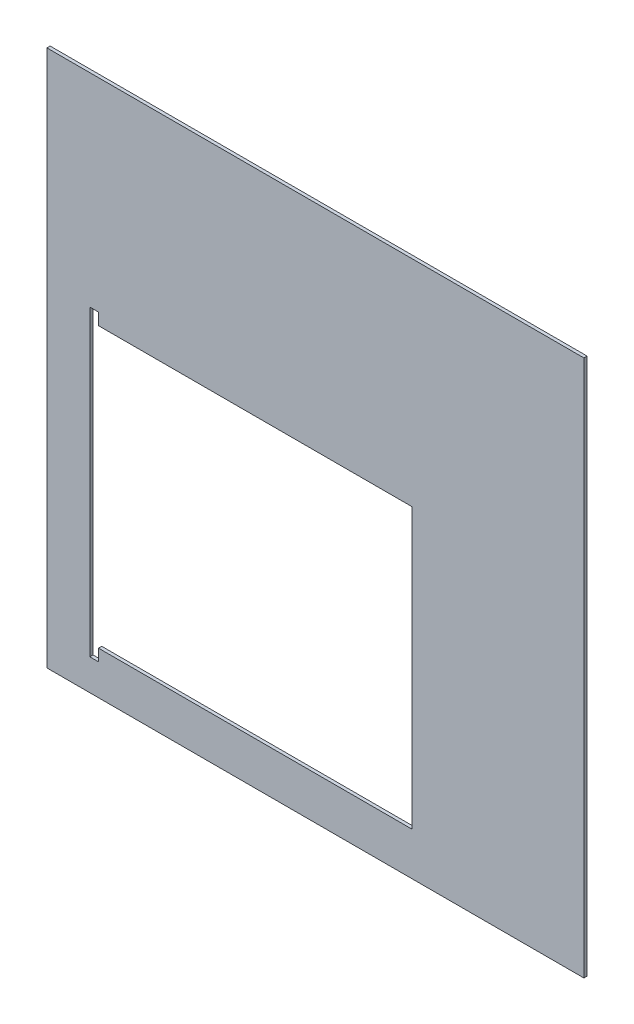
ISO-10303-21;
HEADER;
FILE_DESCRIPTION(('STEP AP214'),'2;1');
FILE_NAME('part.step','',(''),(''),'','','');
FILE_SCHEMA(('AUTOMOTIVE_DESIGN { 1 0 10303 214 1 1 1 1 }'));
ENDSEC;
DATA;
#1=APPLICATION_CONTEXT('core data for automotive mechanical design processes');
#2=APPLICATION_PROTOCOL_DEFINITION('international standard','automotive_design',2000,#1);
#3=PRODUCT_CONTEXT('',#1,'mechanical');
#4=PRODUCT('Part','Part','',(#3));
#5=PRODUCT_RELATED_PRODUCT_CATEGORY('part','',(#4));
#6=PRODUCT_DEFINITION_FORMATION('','',#4);
#7=PRODUCT_DEFINITION_CONTEXT('part definition',#1,'design');
#8=PRODUCT_DEFINITION('design','',#6,#7);
#9=PRODUCT_DEFINITION_SHAPE('','',#8);
#10=(LENGTH_UNIT() NAMED_UNIT(*) SI_UNIT(.MILLI.,.METRE.));
#11=(NAMED_UNIT(*) PLANE_ANGLE_UNIT() SI_UNIT($,.RADIAN.));
#12=(NAMED_UNIT(*) SI_UNIT($,.STERADIAN.) SOLID_ANGLE_UNIT());
#13=UNCERTAINTY_MEASURE_WITH_UNIT(LENGTH_MEASURE(1.E-05),#10,'distance_accuracy_value','');
#14=(GEOMETRIC_REPRESENTATION_CONTEXT(3) GLOBAL_UNCERTAINTY_ASSIGNED_CONTEXT((#13)) GLOBAL_UNIT_ASSIGNED_CONTEXT((#10,
#11,#12)) REPRESENTATION_CONTEXT('',''));
#15=CARTESIAN_POINT('',(0.,0.,0.));
#16=DIRECTION('',(0.,0.,1.));
#17=DIRECTION('',(1.,0.,0.));
#18=AXIS2_PLACEMENT_3D('',#15,#16,#17);
#19=CARTESIAN_POINT('',(0.,0.,1.5));
#20=DIRECTION('',(0.,0.,-1.));
#21=DIRECTION('',(-1.,0.,0.));
#22=AXIS2_PLACEMENT_3D('',#19,#20,#21);
#23=PLANE('',#22);
#24=DIRECTION('',(0.,-1.,0.));
#25=VECTOR('',#24,1.);
#26=CARTESIAN_POINT('',(0.,0.,1.5));
#27=LINE('',#26,#25);
#28=CARTESIAN_POINT('',(0.,250.,1.5));
#29=VERTEX_POINT('',#28);
#30=CARTESIAN_POINT('',(0.,0.,1.5));
#31=VERTEX_POINT('',#30);
#32=EDGE_CURVE('E219',#29,#31,#27,.T.);
#33=ORIENTED_EDGE('',*,*,#32,.T.);
#34=DIRECTION('',(1.,0.,0.));
#35=VECTOR('',#34,1.);
#36=CARTESIAN_POINT('',(0.,0.,1.5));
#37=LINE('',#36,#35);
#38=CARTESIAN_POINT('',(250.,0.,1.5));
#39=VERTEX_POINT('',#38);
#40=EDGE_CURVE('E223',#31,#39,#37,.T.);
#41=ORIENTED_EDGE('',*,*,#40,.T.);
#42=DIRECTION('',(0.,1.,0.));
#43=VECTOR('',#42,1.);
#44=CARTESIAN_POINT('',(250.,0.,1.5));
#45=LINE('',#44,#43);
#46=CARTESIAN_POINT('',(250.,250.,1.5));
#47=VERTEX_POINT('',#46);
#48=EDGE_CURVE('E227',#39,#47,#45,.T.);
#49=ORIENTED_EDGE('',*,*,#48,.T.);
#50=DIRECTION('',(-1.,0.,0.));
#51=VECTOR('',#50,1.);
#52=CARTESIAN_POINT('',(0.,250.,1.5));
#53=LINE('',#52,#51);
#54=EDGE_CURVE('E230',#47,#29,#53,.T.);
#55=ORIENTED_EDGE('',*,*,#54,.T.);
#56=EDGE_LOOP('',(#33,#41,#49,#55));
#57=FACE_BOUND('',#56,.T.);
#58=DIRECTION('',(1.,0.,0.));
#59=VECTOR('',#58,1.);
#60=CARTESIAN_POINT('',(20.,14.5,1.5));
#61=LINE('',#60,#59);
#62=CARTESIAN_POINT('',(20.,14.5,1.5));
#63=VERTEX_POINT('',#62);
#64=CARTESIAN_POINT('',(24.,14.5,1.5));
#65=VERTEX_POINT('',#64);
#66=EDGE_CURVE('E136',#63,#65,#61,.T.);
#67=ORIENTED_EDGE('',*,*,#66,.F.);
#68=DIRECTION('',(0.,-1.,0.));
#69=VECTOR('',#68,1.);
#70=CARTESIAN_POINT('',(20.,20.,1.5));
#71=LINE('',#70,#69);
#72=CARTESIAN_POINT('',(20.,155.5,1.5));
#73=VERTEX_POINT('',#72);
#74=EDGE_CURVE('E130',#73,#63,#71,.T.);
#75=ORIENTED_EDGE('',*,*,#74,.F.);
#76=DIRECTION('',(-1.,0.,0.));
#77=VECTOR('',#76,1.);
#78=CARTESIAN_POINT('',(20.,155.5,1.5));
#79=LINE('',#78,#77);
#80=CARTESIAN_POINT('',(24.,155.5,1.5));
#81=VERTEX_POINT('',#80);
#82=EDGE_CURVE('E169',#81,#73,#79,.T.);
#83=ORIENTED_EDGE('',*,*,#82,.F.);
#84=DIRECTION('',(0.,1.,0.));
#85=VECTOR('',#84,1.);
#86=CARTESIAN_POINT('',(24.,150.,1.5));
#87=LINE('',#86,#85);
#88=CARTESIAN_POINT('',(24.,150.,1.5));
#89=VERTEX_POINT('',#88);
#90=EDGE_CURVE('E166',#89,#81,#87,.T.);
#91=ORIENTED_EDGE('',*,*,#90,.F.);
#92=DIRECTION('',(-1.,0.,0.));
#93=VECTOR('',#92,1.);
#94=CARTESIAN_POINT('',(24.,150.,1.5));
#95=LINE('',#94,#93);
#96=CARTESIAN_POINT('',(170.,150.,1.5));
#97=VERTEX_POINT('',#96);
#98=EDGE_CURVE('E163',#97,#89,#95,.T.);
#99=ORIENTED_EDGE('',*,*,#98,.F.);
#100=DIRECTION('',(0.,1.,0.));
#101=VECTOR('',#100,1.);
#102=CARTESIAN_POINT('',(170.,20.,1.5));
#103=LINE('',#102,#101);
#104=CARTESIAN_POINT('',(170.,20.,1.5));
#105=VERTEX_POINT('',#104);
#106=EDGE_CURVE('E160',#105,#97,#103,.T.);
#107=ORIENTED_EDGE('',*,*,#106,.F.);
#108=DIRECTION('',(1.,0.,0.));
#109=VECTOR('',#108,1.);
#110=CARTESIAN_POINT('',(24.,20.,1.5));
#111=LINE('',#110,#109);
#112=CARTESIAN_POINT('',(24.,20.,1.5));
#113=VERTEX_POINT('',#112);
#114=EDGE_CURVE('E155',#113,#105,#111,.T.);
#115=ORIENTED_EDGE('',*,*,#114,.F.);
#116=DIRECTION('',(0.,1.,0.));
#117=VECTOR('',#116,1.);
#118=CARTESIAN_POINT('',(24.,20.,1.5));
#119=LINE('',#118,#117);
#120=EDGE_CURVE('E151',#65,#113,#119,.T.);
#121=ORIENTED_EDGE('',*,*,#120,.F.);
#122=EDGE_LOOP('',(#67,#75,#83,#91,#99,#107,#115,#121));
#123=FACE_BOUND('',#122,.T.);
#124=ADVANCED_FACE('F43',(#57,#123),#23,.F.);
#125=CARTESIAN_POINT('',(0.,0.,0.));
#126=DIRECTION('',(0.,0.,-1.));
#127=DIRECTION('',(-1.,0.,0.));
#128=AXIS2_PLACEMENT_3D('',#125,#126,#127);
#129=PLANE('',#128);
#130=DIRECTION('',(0.,-1.,0.));
#131=VECTOR('',#130,1.);
#132=CARTESIAN_POINT('',(0.,0.,0.));
#133=LINE('',#132,#131);
#134=CARTESIAN_POINT('',(0.,250.,0.));
#135=VERTEX_POINT('',#134);
#136=CARTESIAN_POINT('',(0.,0.,0.));
#137=VERTEX_POINT('',#136);
#138=EDGE_CURVE('E146',#135,#137,#133,.T.);
#139=ORIENTED_EDGE('',*,*,#138,.F.);
#140=DIRECTION('',(-1.,0.,0.));
#141=VECTOR('',#140,1.);
#142=CARTESIAN_POINT('',(0.,250.,0.));
#143=LINE('',#142,#141);
#144=CARTESIAN_POINT('',(250.,250.,0.));
#145=VERTEX_POINT('',#144);
#146=EDGE_CURVE('E224',#145,#135,#143,.T.);
#147=ORIENTED_EDGE('',*,*,#146,.F.);
#148=DIRECTION('',(0.,1.,0.));
#149=VECTOR('',#148,1.);
#150=CARTESIAN_POINT('',(250.,0.,0.));
#151=LINE('',#150,#149);
#152=CARTESIAN_POINT('',(250.,0.,0.));
#153=VERTEX_POINT('',#152);
#154=EDGE_CURVE('E240',#153,#145,#151,.T.);
#155=ORIENTED_EDGE('',*,*,#154,.F.);
#156=DIRECTION('',(1.,0.,0.));
#157=VECTOR('',#156,1.);
#158=CARTESIAN_POINT('',(0.,0.,0.));
#159=LINE('',#158,#157);
#160=EDGE_CURVE('E237',#137,#153,#159,.T.);
#161=ORIENTED_EDGE('',*,*,#160,.F.);
#162=EDGE_LOOP('',(#139,#147,#155,#161));
#163=FACE_BOUND('',#162,.T.);
#164=DIRECTION('',(0.,-1.,0.));
#165=VECTOR('',#164,1.);
#166=CARTESIAN_POINT('',(20.,20.,0.));
#167=LINE('',#166,#165);
#168=CARTESIAN_POINT('',(20.,155.5,0.));
#169=VERTEX_POINT('',#168);
#170=CARTESIAN_POINT('',(20.,14.5,0.));
#171=VERTEX_POINT('',#170);
#172=EDGE_CURVE('E137',#169,#171,#167,.T.);
#173=ORIENTED_EDGE('',*,*,#172,.T.);
#174=DIRECTION('',(1.,0.,0.));
#175=VECTOR('',#174,1.);
#176=CARTESIAN_POINT('',(20.,14.5,0.));
#177=LINE('',#176,#175);
#178=CARTESIAN_POINT('',(24.,14.5,0.));
#179=VERTEX_POINT('',#178);
#180=EDGE_CURVE('E143',#171,#179,#177,.T.);
#181=ORIENTED_EDGE('',*,*,#180,.T.);
#182=DIRECTION('',(0.,1.,0.));
#183=VECTOR('',#182,1.);
#184=CARTESIAN_POINT('',(24.,20.,0.));
#185=LINE('',#184,#183);
#186=CARTESIAN_POINT('',(24.,20.,0.));
#187=VERTEX_POINT('',#186);
#188=EDGE_CURVE('E174',#179,#187,#185,.T.);
#189=ORIENTED_EDGE('',*,*,#188,.T.);
#190=DIRECTION('',(1.,0.,0.));
#191=VECTOR('',#190,1.);
#192=CARTESIAN_POINT('',(24.,20.,0.));
#193=LINE('',#192,#191);
#194=CARTESIAN_POINT('',(170.,20.,0.));
#195=VERTEX_POINT('',#194);
#196=EDGE_CURVE('E178',#187,#195,#193,.T.);
#197=ORIENTED_EDGE('',*,*,#196,.T.);
#198=DIRECTION('',(0.,1.,0.));
#199=VECTOR('',#198,1.);
#200=CARTESIAN_POINT('',(170.,20.,0.));
#201=LINE('',#200,#199);
#202=CARTESIAN_POINT('',(170.,150.,0.));
#203=VERTEX_POINT('',#202);
#204=EDGE_CURVE('E182',#195,#203,#201,.T.);
#205=ORIENTED_EDGE('',*,*,#204,.T.);
#206=DIRECTION('',(-1.,0.,0.));
#207=VECTOR('',#206,1.);
#208=CARTESIAN_POINT('',(24.,150.,0.));
#209=LINE('',#208,#207);
#210=CARTESIAN_POINT('',(24.,150.,0.));
#211=VERTEX_POINT('',#210);
#212=EDGE_CURVE('E186',#203,#211,#209,.T.);
#213=ORIENTED_EDGE('',*,*,#212,.T.);
#214=DIRECTION('',(0.,1.,0.));
#215=VECTOR('',#214,1.);
#216=CARTESIAN_POINT('',(24.,150.,0.));
#217=LINE('',#216,#215);
#218=CARTESIAN_POINT('',(24.,155.5,0.));
#219=VERTEX_POINT('',#218);
#220=EDGE_CURVE('E190',#211,#219,#217,.T.);
#221=ORIENTED_EDGE('',*,*,#220,.T.);
#222=DIRECTION('',(-1.,0.,0.));
#223=VECTOR('',#222,1.);
#224=CARTESIAN_POINT('',(20.,155.5,0.));
#225=LINE('',#224,#223);
#226=EDGE_CURVE('E194',#219,#169,#225,.T.);
#227=ORIENTED_EDGE('',*,*,#226,.T.);
#228=EDGE_LOOP('',(#173,#181,#189,#197,#205,#213,#221,#227));
#229=FACE_BOUND('',#228,.T.);
#230=ADVANCED_FACE('F263',(#163,#229),#129,.T.);
#231=CARTESIAN_POINT('',(0.,0.,1.5));
#232=DIRECTION('',(1.,0.,0.));
#233=DIRECTION('',(0.,0.,-1.));
#234=AXIS2_PLACEMENT_3D('',#231,#232,#233);
#235=PLANE('',#234);
#236=ORIENTED_EDGE('',*,*,#138,.T.);
#237=DIRECTION('',(0.,0.,-1.));
#238=VECTOR('',#237,1.);
#239=CARTESIAN_POINT('',(0.,0.,1.5));
#240=LINE('',#239,#238);
#241=EDGE_CURVE('E11',#31,#137,#240,.T.);
#242=ORIENTED_EDGE('',*,*,#241,.F.);
#243=ORIENTED_EDGE('',*,*,#32,.F.);
#244=DIRECTION('',(0.,0.,-1.));
#245=VECTOR('',#244,1.);
#246=CARTESIAN_POINT('',(0.,250.,1.5));
#247=LINE('',#246,#245);
#248=EDGE_CURVE('E233',#29,#135,#247,.T.);
#249=ORIENTED_EDGE('',*,*,#248,.T.);
#250=EDGE_LOOP('',(#236,#242,#243,#249));
#251=FACE_BOUND('',#250,.T.);
#252=ADVANCED_FACE('F45',(#251),#235,.F.);
#253=CARTESIAN_POINT('',(0.,0.,1.5));
#254=DIRECTION('',(0.,1.,0.));
#255=DIRECTION('',(0.,0.,1.));
#256=AXIS2_PLACEMENT_3D('',#253,#254,#255);
#257=PLANE('',#256);
#258=ORIENTED_EDGE('',*,*,#160,.T.);
#259=DIRECTION('',(0.,0.,-1.));
#260=VECTOR('',#259,1.);
#261=CARTESIAN_POINT('',(250.,0.,1.5));
#262=LINE('',#261,#260);
#263=EDGE_CURVE('E52',#39,#153,#262,.T.);
#264=ORIENTED_EDGE('',*,*,#263,.F.);
#265=ORIENTED_EDGE('',*,*,#40,.F.);
#266=ORIENTED_EDGE('',*,*,#241,.T.);
#267=EDGE_LOOP('',(#258,#264,#265,#266));
#268=FACE_BOUND('',#267,.T.);
#269=ADVANCED_FACE('F273',(#268),#257,.F.);
#270=CARTESIAN_POINT('',(250.,0.,1.5));
#271=DIRECTION('',(-1.,0.,0.));
#272=DIRECTION('',(0.,0.,1.));
#273=AXIS2_PLACEMENT_3D('',#270,#271,#272);
#274=PLANE('',#273);
#275=ORIENTED_EDGE('',*,*,#154,.T.);
#276=DIRECTION('',(0.,0.,-1.));
#277=VECTOR('',#276,1.);
#278=CARTESIAN_POINT('',(250.,250.,1.5));
#279=LINE('',#278,#277);
#280=EDGE_CURVE('E248',#47,#145,#279,.T.);
#281=ORIENTED_EDGE('',*,*,#280,.F.);
#282=ORIENTED_EDGE('',*,*,#48,.F.);
#283=ORIENTED_EDGE('',*,*,#263,.T.);
#284=EDGE_LOOP('',(#275,#281,#282,#283));
#285=FACE_BOUND('',#284,.T.);
#286=ADVANCED_FACE('F257',(#285),#274,.F.);
#287=CARTESIAN_POINT('',(0.,250.,1.5));
#288=DIRECTION('',(0.,-1.,0.));
#289=DIRECTION('',(0.,0.,-1.));
#290=AXIS2_PLACEMENT_3D('',#287,#288,#289);
#291=PLANE('',#290);
#292=ORIENTED_EDGE('',*,*,#146,.T.);
#293=ORIENTED_EDGE('',*,*,#248,.F.);
#294=ORIENTED_EDGE('',*,*,#54,.F.);
#295=ORIENTED_EDGE('',*,*,#280,.T.);
#296=EDGE_LOOP('',(#292,#293,#294,#295));
#297=FACE_BOUND('',#296,.T.);
#298=ADVANCED_FACE('F267',(#297),#291,.F.);
#299=CARTESIAN_POINT('',(20.,14.5,1.5));
#300=DIRECTION('',(0.,1.,0.));
#301=DIRECTION('',(0.,0.,1.));
#302=AXIS2_PLACEMENT_3D('',#299,#300,#301);
#303=PLANE('',#302);
#304=ORIENTED_EDGE('',*,*,#180,.F.);
#305=DIRECTION('',(0.,0.,-1.));
#306=VECTOR('',#305,1.);
#307=CARTESIAN_POINT('',(20.,14.5,1.5));
#308=LINE('',#307,#306);
#309=EDGE_CURVE('E64',#63,#171,#308,.T.);
#310=ORIENTED_EDGE('',*,*,#309,.F.);
#311=ORIENTED_EDGE('',*,*,#66,.T.);
#312=DIRECTION('',(0.,0.,-1.));
#313=VECTOR('',#312,1.);
#314=CARTESIAN_POINT('',(24.,14.5,1.5));
#315=LINE('',#314,#313);
#316=EDGE_CURVE('E147',#65,#179,#315,.T.);
#317=ORIENTED_EDGE('',*,*,#316,.T.);
#318=EDGE_LOOP('',(#304,#310,#311,#317));
#319=FACE_BOUND('',#318,.T.);
#320=ADVANCED_FACE('F140',(#319),#303,.T.);
#321=CARTESIAN_POINT('',(24.,20.,1.5));
#322=DIRECTION('',(-1.,0.,0.));
#323=DIRECTION('',(0.,0.,1.));
#324=AXIS2_PLACEMENT_3D('',#321,#322,#323);
#325=PLANE('',#324);
#326=ORIENTED_EDGE('',*,*,#188,.F.);
#327=ORIENTED_EDGE('',*,*,#316,.F.);
#328=ORIENTED_EDGE('',*,*,#120,.T.);
#329=DIRECTION('',(0.,0.,-1.));
#330=VECTOR('',#329,1.);
#331=CARTESIAN_POINT('',(24.,20.,1.5));
#332=LINE('',#331,#330);
#333=EDGE_CURVE('E214',#113,#187,#332,.T.);
#334=ORIENTED_EDGE('',*,*,#333,.T.);
#335=EDGE_LOOP('',(#326,#327,#328,#334));
#336=FACE_BOUND('',#335,.T.);
#337=ADVANCED_FACE('F293',(#336),#325,.T.);
#338=CARTESIAN_POINT('',(24.,20.,1.5));
#339=DIRECTION('',(0.,1.,0.));
#340=DIRECTION('',(-1.,0.,0.));
#341=AXIS2_PLACEMENT_3D('',#338,#339,#340);
#342=PLANE('',#341);
#343=ORIENTED_EDGE('',*,*,#196,.F.);
#344=ORIENTED_EDGE('',*,*,#333,.F.);
#345=ORIENTED_EDGE('',*,*,#114,.T.);
#346=DIRECTION('',(0.,0.,-1.));
#347=VECTOR('',#346,1.);
#348=CARTESIAN_POINT('',(170.,20.,1.5));
#349=LINE('',#348,#347);
#350=EDGE_CURVE('E211',#105,#195,#349,.T.);
#351=ORIENTED_EDGE('',*,*,#350,.T.);
#352=EDGE_LOOP('',(#343,#344,#345,#351));
#353=FACE_BOUND('',#352,.T.);
#354=ADVANCED_FACE('F297',(#353),#342,.T.);
#355=CARTESIAN_POINT('',(170.,20.,1.5));
#356=DIRECTION('',(-1.,0.,0.));
#357=DIRECTION('',(0.,0.,1.));
#358=AXIS2_PLACEMENT_3D('',#355,#356,#357);
#359=PLANE('',#358);
#360=ORIENTED_EDGE('',*,*,#204,.F.);
#361=ORIENTED_EDGE('',*,*,#350,.F.);
#362=ORIENTED_EDGE('',*,*,#106,.T.);
#363=DIRECTION('',(0.,0.,-1.));
#364=VECTOR('',#363,1.);
#365=CARTESIAN_POINT('',(170.,150.,1.5));
#366=LINE('',#365,#364);
#367=EDGE_CURVE('E208',#97,#203,#366,.T.);
#368=ORIENTED_EDGE('',*,*,#367,.T.);
#369=EDGE_LOOP('',(#360,#361,#362,#368));
#370=FACE_BOUND('',#369,.T.);
#371=ADVANCED_FACE('F302',(#370),#359,.T.);
#372=CARTESIAN_POINT('',(24.,150.,1.5));
#373=DIRECTION('',(0.,-1.,0.));
#374=DIRECTION('',(0.,0.,-1.));
#375=AXIS2_PLACEMENT_3D('',#372,#373,#374);
#376=PLANE('',#375);
#377=ORIENTED_EDGE('',*,*,#212,.F.);
#378=ORIENTED_EDGE('',*,*,#367,.F.);
#379=ORIENTED_EDGE('',*,*,#98,.T.);
#380=DIRECTION('',(0.,0.,-1.));
#381=VECTOR('',#380,1.);
#382=CARTESIAN_POINT('',(24.,150.,1.5));
#383=LINE('',#382,#381);
#384=EDGE_CURVE('E205',#89,#211,#383,.T.);
#385=ORIENTED_EDGE('',*,*,#384,.T.);
#386=EDGE_LOOP('',(#377,#378,#379,#385));
#387=FACE_BOUND('',#386,.T.);
#388=ADVANCED_FACE('F309',(#387),#376,.T.);
#389=CARTESIAN_POINT('',(24.,150.,1.5));
#390=DIRECTION('',(-1.,0.,0.));
#391=DIRECTION('',(0.,0.,1.));
#392=AXIS2_PLACEMENT_3D('',#389,#390,#391);
#393=PLANE('',#392);
#394=ORIENTED_EDGE('',*,*,#220,.F.);
#395=ORIENTED_EDGE('',*,*,#384,.F.);
#396=ORIENTED_EDGE('',*,*,#90,.T.);
#397=DIRECTION('',(0.,0.,-1.));
#398=VECTOR('',#397,1.);
#399=CARTESIAN_POINT('',(24.,155.5,1.5));
#400=LINE('',#399,#398);
#401=EDGE_CURVE('E202',#81,#219,#400,.T.);
#402=ORIENTED_EDGE('',*,*,#401,.T.);
#403=EDGE_LOOP('',(#394,#395,#396,#402));
#404=FACE_BOUND('',#403,.T.);
#405=ADVANCED_FACE('F313',(#404),#393,.T.);
#406=CARTESIAN_POINT('',(20.,155.5,1.5));
#407=DIRECTION('',(0.,-1.,0.));
#408=DIRECTION('',(0.,0.,-1.));
#409=AXIS2_PLACEMENT_3D('',#406,#407,#408);
#410=PLANE('',#409);
#411=ORIENTED_EDGE('',*,*,#226,.F.);
#412=ORIENTED_EDGE('',*,*,#401,.F.);
#413=ORIENTED_EDGE('',*,*,#82,.T.);
#414=DIRECTION('',(0.,0.,-1.));
#415=VECTOR('',#414,1.);
#416=CARTESIAN_POINT('',(20.,155.5,1.5));
#417=LINE('',#416,#415);
#418=EDGE_CURVE('E59',#73,#169,#417,.T.);
#419=ORIENTED_EDGE('',*,*,#418,.T.);
#420=EDGE_LOOP('',(#411,#412,#413,#419));
#421=FACE_BOUND('',#420,.T.);
#422=ADVANCED_FACE('F317',(#421),#410,.T.);
#423=CARTESIAN_POINT('',(20.,20.,1.5));
#424=DIRECTION('',(1.,0.,0.));
#425=DIRECTION('',(0.,0.,-1.));
#426=AXIS2_PLACEMENT_3D('',#423,#424,#425);
#427=PLANE('',#426);
#428=ORIENTED_EDGE('',*,*,#172,.F.);
#429=ORIENTED_EDGE('',*,*,#418,.F.);
#430=ORIENTED_EDGE('',*,*,#74,.T.);
#431=ORIENTED_EDGE('',*,*,#309,.T.);
#432=EDGE_LOOP('',(#428,#429,#430,#431));
#433=FACE_BOUND('',#432,.T.);
#434=ADVANCED_FACE('F131',(#433),#427,.T.);
#435=CLOSED_SHELL('',(#124,#230,#252,#269,#286,#298,#320,#337,#354,#371,#388,#405,#422,#434));
#436=MANIFOLD_SOLID_BREP('B2',#435);
#437=ADVANCED_BREP_SHAPE_REPRESENTATION('',(#18,#436),#14);
#438=SHAPE_DEFINITION_REPRESENTATION(#9,#437);
ENDSEC;
END-ISO-10303-21;
